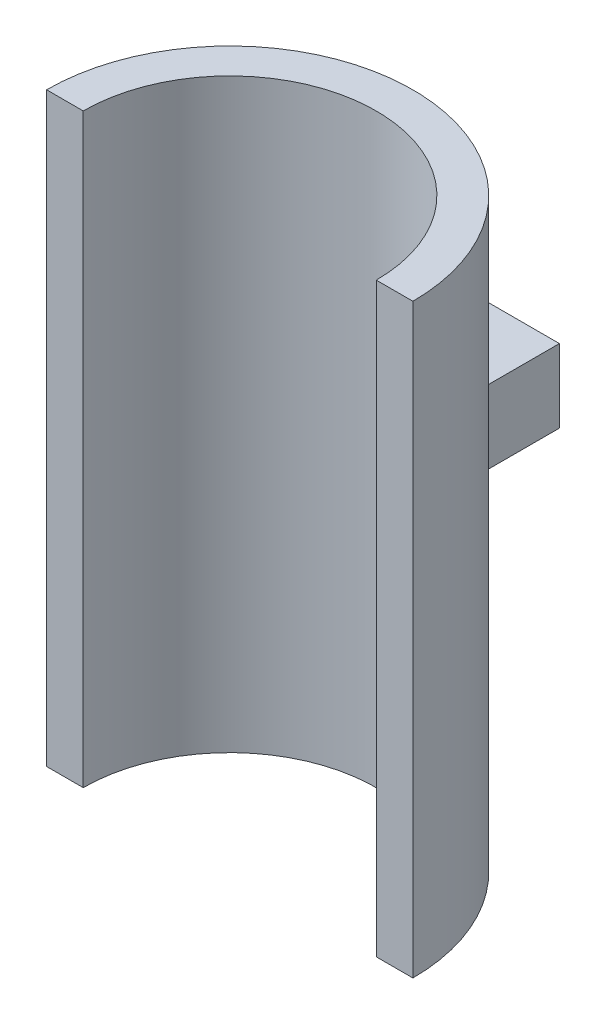
ISO-10303-21;
HEADER;
FILE_DESCRIPTION(('STEP AP214'),'2;1');
FILE_NAME('part.step','',(''),(''),'','','');
FILE_SCHEMA(('AUTOMOTIVE_DESIGN { 1 0 10303 214 1 1 1 1 }'));
ENDSEC;
DATA;
#1=APPLICATION_CONTEXT('core data for automotive mechanical design processes');
#2=APPLICATION_PROTOCOL_DEFINITION('international standard','automotive_design',2000,#1);
#3=PRODUCT_CONTEXT('',#1,'mechanical');
#4=PRODUCT('Part','Part','',(#3));
#5=PRODUCT_RELATED_PRODUCT_CATEGORY('part','',(#4));
#6=PRODUCT_DEFINITION_FORMATION('','',#4);
#7=PRODUCT_DEFINITION_CONTEXT('part definition',#1,'design');
#8=PRODUCT_DEFINITION('design','',#6,#7);
#9=PRODUCT_DEFINITION_SHAPE('','',#8);
#10=(LENGTH_UNIT() NAMED_UNIT(*) SI_UNIT(.MILLI.,.METRE.));
#11=(NAMED_UNIT(*) PLANE_ANGLE_UNIT() SI_UNIT($,.RADIAN.));
#12=(NAMED_UNIT(*) SI_UNIT($,.STERADIAN.) SOLID_ANGLE_UNIT());
#13=UNCERTAINTY_MEASURE_WITH_UNIT(LENGTH_MEASURE(1.E-05),#10,'distance_accuracy_value','');
#14=(GEOMETRIC_REPRESENTATION_CONTEXT(3) GLOBAL_UNCERTAINTY_ASSIGNED_CONTEXT((#13)) GLOBAL_UNIT_ASSIGNED_CONTEXT((#10,
#11,#12)) REPRESENTATION_CONTEXT('',''));
#15=CARTESIAN_POINT('',(0.,0.,0.));
#16=DIRECTION('',(0.,0.,1.));
#17=DIRECTION('',(1.,0.,0.));
#18=AXIS2_PLACEMENT_3D('',#15,#16,#17);
#19=CARTESIAN_POINT('',(0.,23.6596720559569,0.));
#20=DIRECTION('',(0.,-1.,0.));
#21=DIRECTION('',(0.,0.,-1.));
#22=AXIS2_PLACEMENT_3D('',#19,#20,#21);
#23=CYLINDRICAL_SURFACE('',#22,5.);
#24=CARTESIAN_POINT('',(0.,7.65967205595689,0.));
#25=DIRECTION('',(0.,1.,0.));
#26=DIRECTION('',(0.,0.,1.));
#27=AXIS2_PLACEMENT_3D('',#24,#25,#26);
#28=CIRCLE('',#27,5.);
#29=CARTESIAN_POINT('',(5.,7.65967205595689,0.));
#30=VERTEX_POINT('',#29);
#31=CARTESIAN_POINT('',(-5.,7.65967205595689,0.));
#32=VERTEX_POINT('',#31);
#33=EDGE_CURVE('E130',#30,#32,#28,.T.);
#34=ORIENTED_EDGE('',*,*,#33,.T.);
#35=DIRECTION('',(0.,-1.,0.));
#36=VECTOR('',#35,1.);
#37=CARTESIAN_POINT('',(-5.,23.6596720559569,0.));
#38=LINE('',#37,#36);
#39=CARTESIAN_POINT('',(-5.,23.6596720559569,0.));
#40=VERTEX_POINT('',#39);
#41=EDGE_CURVE('E11',#40,#32,#38,.T.);
#42=ORIENTED_EDGE('',*,*,#41,.F.);
#43=CARTESIAN_POINT('',(0.,23.6596720559569,0.));
#44=DIRECTION('',(0.,1.,0.));
#45=DIRECTION('',(0.,0.,1.));
#46=AXIS2_PLACEMENT_3D('',#43,#44,#45);
#47=CIRCLE('',#46,5.);
#48=CARTESIAN_POINT('',(5.,23.6596720559569,0.));
#49=VERTEX_POINT('',#48);
#50=EDGE_CURVE('E119',#49,#40,#47,.T.);
#51=ORIENTED_EDGE('',*,*,#50,.F.);
#52=DIRECTION('',(0.,-1.,0.));
#53=VECTOR('',#52,1.);
#54=CARTESIAN_POINT('',(5.,23.6596720559569,0.));
#55=LINE('',#54,#53);
#56=EDGE_CURVE('E129',#49,#30,#55,.T.);
#57=ORIENTED_EDGE('',*,*,#56,.T.);
#58=EDGE_LOOP('',(#34,#42,#51,#57));
#59=FACE_BOUND('',#58,.T.);
#60=DIRECTION('',(0.,-1.,0.));
#61=VECTOR('',#60,1.);
#62=CARTESIAN_POINT('',(1.,23.6596720559569,-4.89897948556636));
#63=LINE('',#62,#61);
#64=CARTESIAN_POINT('',(1.,14.6596720559569,-4.89897948556636));
#65=VERTEX_POINT('',#64);
#66=CARTESIAN_POINT('',(1.,16.6596720559569,-4.89897948556636));
#67=VERTEX_POINT('',#66);
#68=EDGE_CURVE('E45',#65,#67,#63,.F.);
#69=ORIENTED_EDGE('',*,*,#68,.T.);
#70=CARTESIAN_POINT('',(0.,16.6596720559569,0.));
#71=DIRECTION('',(0.,-1.,0.));
#72=DIRECTION('',(0.,0.,-1.));
#73=AXIS2_PLACEMENT_3D('',#70,#71,#72);
#74=CIRCLE('',#73,5.);
#75=CARTESIAN_POINT('',(-1.,16.6596720559569,-4.89897948556636));
#76=VERTEX_POINT('',#75);
#77=EDGE_CURVE('E49',#67,#76,#74,.F.);
#78=ORIENTED_EDGE('',*,*,#77,.T.);
#79=DIRECTION('',(0.,-1.,0.));
#80=VECTOR('',#79,1.);
#81=CARTESIAN_POINT('',(-1.,23.6596720559569,-4.89897948556636));
#82=LINE('',#81,#80);
#83=CARTESIAN_POINT('',(-1.,14.6596720559569,-4.89897948556636));
#84=VERTEX_POINT('',#83);
#85=EDGE_CURVE('E90',#76,#84,#82,.T.);
#86=ORIENTED_EDGE('',*,*,#85,.T.);
#87=CARTESIAN_POINT('',(0.,14.6596720559569,0.));
#88=DIRECTION('',(0.,1.,0.));
#89=DIRECTION('',(0.,0.,1.));
#90=AXIS2_PLACEMENT_3D('',#87,#88,#89);
#91=CIRCLE('',#90,5.);
#92=EDGE_CURVE('E92',#84,#65,#91,.F.);
#93=ORIENTED_EDGE('',*,*,#92,.T.);
#94=EDGE_LOOP('',(#69,#78,#86,#93));
#95=FACE_BOUND('',#94,.T.);
#96=ADVANCED_FACE('F31',(#59,#95),#23,.T.);
#97=CARTESIAN_POINT('',(-5.,23.6596720559569,0.));
#98=DIRECTION('',(0.,0.,-1.));
#99=DIRECTION('',(-1.,0.,0.));
#100=AXIS2_PLACEMENT_3D('',#97,#98,#99);
#101=PLANE('',#100);
#102=DIRECTION('',(1.,0.,0.));
#103=VECTOR('',#102,1.);
#104=CARTESIAN_POINT('',(-5.,7.65967205595689,0.));
#105=LINE('',#104,#103);
#106=CARTESIAN_POINT('',(-4.,7.65967205595689,0.));
#107=VERTEX_POINT('',#106);
#108=EDGE_CURVE('E133',#32,#107,#105,.T.);
#109=ORIENTED_EDGE('',*,*,#108,.T.);
#110=DIRECTION('',(0.,-1.,0.));
#111=VECTOR('',#110,1.);
#112=CARTESIAN_POINT('',(-4.,23.6596720559569,0.));
#113=LINE('',#112,#111);
#114=CARTESIAN_POINT('',(-4.,23.6596720559569,0.));
#115=VERTEX_POINT('',#114);
#116=EDGE_CURVE('E38',#115,#107,#113,.T.);
#117=ORIENTED_EDGE('',*,*,#116,.F.);
#118=DIRECTION('',(1.,0.,0.));
#119=VECTOR('',#118,1.);
#120=CARTESIAN_POINT('',(-5.,23.6596720559569,0.));
#121=LINE('',#120,#119);
#122=EDGE_CURVE('E122',#40,#115,#121,.T.);
#123=ORIENTED_EDGE('',*,*,#122,.F.);
#124=ORIENTED_EDGE('',*,*,#41,.T.);
#125=EDGE_LOOP('',(#109,#117,#123,#124));
#126=FACE_BOUND('',#125,.T.);
#127=ADVANCED_FACE('F164',(#126),#101,.F.);
#128=CARTESIAN_POINT('',(0.,23.6596720559569,0.));
#129=DIRECTION('',(0.,-1.,0.));
#130=DIRECTION('',(0.,0.,-1.));
#131=AXIS2_PLACEMENT_3D('',#128,#129,#130);
#132=CYLINDRICAL_SURFACE('',#131,4.);
#133=CARTESIAN_POINT('',(0.,7.65967205595689,0.));
#134=DIRECTION('',(0.,-1.,0.));
#135=DIRECTION('',(0.,0.,1.));
#136=AXIS2_PLACEMENT_3D('',#133,#134,#135);
#137=CIRCLE('',#136,4.);
#138=CARTESIAN_POINT('',(4.,7.65967205595689,0.));
#139=VERTEX_POINT('',#138);
#140=EDGE_CURVE('E136',#107,#139,#137,.T.);
#141=ORIENTED_EDGE('',*,*,#140,.T.);
#142=DIRECTION('',(0.,-1.,0.));
#143=VECTOR('',#142,1.);
#144=CARTESIAN_POINT('',(4.,23.6596720559569,0.));
#145=LINE('',#144,#143);
#146=CARTESIAN_POINT('',(4.,23.6596720559569,0.));
#147=VERTEX_POINT('',#146);
#148=EDGE_CURVE('E141',#147,#139,#145,.T.);
#149=ORIENTED_EDGE('',*,*,#148,.F.);
#150=CARTESIAN_POINT('',(0.,23.6596720559569,0.));
#151=DIRECTION('',(0.,-1.,0.));
#152=DIRECTION('',(0.,0.,1.));
#153=AXIS2_PLACEMENT_3D('',#150,#151,#152);
#154=CIRCLE('',#153,4.);
#155=EDGE_CURVE('E125',#115,#147,#154,.T.);
#156=ORIENTED_EDGE('',*,*,#155,.F.);
#157=ORIENTED_EDGE('',*,*,#116,.T.);
#158=EDGE_LOOP('',(#141,#149,#156,#157));
#159=FACE_BOUND('',#158,.T.);
#160=ADVANCED_FACE('F148',(#159),#132,.F.);
#161=CARTESIAN_POINT('',(4.,23.6596720559569,0.));
#162=DIRECTION('',(0.,0.,-1.));
#163=DIRECTION('',(-1.,0.,0.));
#164=AXIS2_PLACEMENT_3D('',#161,#162,#163);
#165=PLANE('',#164);
#166=DIRECTION('',(1.,0.,0.));
#167=VECTOR('',#166,1.);
#168=CARTESIAN_POINT('',(4.,7.65967205595689,0.));
#169=LINE('',#168,#167);
#170=EDGE_CURVE('E123',#139,#30,#169,.T.);
#171=ORIENTED_EDGE('',*,*,#170,.T.);
#172=ORIENTED_EDGE('',*,*,#56,.F.);
#173=DIRECTION('',(1.,0.,0.));
#174=VECTOR('',#173,1.);
#175=CARTESIAN_POINT('',(4.,23.6596720559569,0.));
#176=LINE('',#175,#174);
#177=EDGE_CURVE('E127',#147,#49,#176,.T.);
#178=ORIENTED_EDGE('',*,*,#177,.F.);
#179=ORIENTED_EDGE('',*,*,#148,.T.);
#180=EDGE_LOOP('',(#171,#172,#178,#179));
#181=FACE_BOUND('',#180,.T.);
#182=ADVANCED_FACE('F157',(#181),#165,.F.);
#183=CARTESIAN_POINT('',(0.,23.6596720559569,0.));
#184=DIRECTION('',(0.,1.,0.));
#185=DIRECTION('',(0.,0.,1.));
#186=AXIS2_PLACEMENT_3D('',#183,#184,#185);
#187=PLANE('',#186);
#188=ORIENTED_EDGE('',*,*,#50,.T.);
#189=ORIENTED_EDGE('',*,*,#122,.T.);
#190=ORIENTED_EDGE('',*,*,#155,.T.);
#191=ORIENTED_EDGE('',*,*,#177,.T.);
#192=EDGE_LOOP('',(#188,#189,#190,#191));
#193=FACE_BOUND('',#192,.T.);
#194=ADVANCED_FACE('F163',(#193),#187,.T.);
#195=CARTESIAN_POINT('',(0.,7.65967205595689,0.));
#196=DIRECTION('',(0.,1.,0.));
#197=DIRECTION('',(0.,0.,1.));
#198=AXIS2_PLACEMENT_3D('',#195,#196,#197);
#199=PLANE('',#198);
#200=ORIENTED_EDGE('',*,*,#33,.F.);
#201=ORIENTED_EDGE('',*,*,#170,.F.);
#202=ORIENTED_EDGE('',*,*,#140,.F.);
#203=ORIENTED_EDGE('',*,*,#108,.F.);
#204=EDGE_LOOP('',(#200,#201,#202,#203));
#205=FACE_BOUND('',#204,.T.);
#206=ADVANCED_FACE('F154',(#205),#199,.F.);
#207=CARTESIAN_POINT('',(1.,14.6596720559569,500000.));
#208=DIRECTION('',(-1.,0.,0.));
#209=DIRECTION('',(0.,0.,1.));
#210=AXIS2_PLACEMENT_3D('',#207,#208,#209);
#211=PLANE('',#210);
#212=ORIENTED_EDGE('',*,*,#68,.F.);
#213=DIRECTION('',(0.,0.,-1.));
#214=VECTOR('',#213,1.);
#215=CARTESIAN_POINT('',(1.,14.6596720559569,500000.));
#216=LINE('',#215,#214);
#217=CARTESIAN_POINT('',(1.,14.6596720559569,-8.));
#218=VERTEX_POINT('',#217);
#219=EDGE_CURVE('E103',#65,#218,#216,.T.);
#220=ORIENTED_EDGE('',*,*,#219,.T.);
#221=DIRECTION('',(0.,1.,0.));
#222=VECTOR('',#221,1.);
#223=CARTESIAN_POINT('',(1.,14.6596720559569,-8.));
#224=LINE('',#223,#222);
#225=CARTESIAN_POINT('',(1.,16.6596720559569,-8.));
#226=VERTEX_POINT('',#225);
#227=EDGE_CURVE('E134',#218,#226,#224,.T.);
#228=ORIENTED_EDGE('',*,*,#227,.T.);
#229=DIRECTION('',(0.,0.,-1.));
#230=VECTOR('',#229,1.);
#231=CARTESIAN_POINT('',(1.,16.6596720559569,500000.));
#232=LINE('',#231,#230);
#233=EDGE_CURVE('E113',#67,#226,#232,.T.);
#234=ORIENTED_EDGE('',*,*,#233,.F.);
#235=EDGE_LOOP('',(#212,#220,#228,#234));
#236=FACE_BOUND('',#235,.T.);
#237=ADVANCED_FACE('F176',(#236),#211,.F.);
#238=CARTESIAN_POINT('',(-1.,16.6596720559569,500000.));
#239=DIRECTION('',(0.,-1.,0.));
#240=DIRECTION('',(0.,0.,-1.));
#241=AXIS2_PLACEMENT_3D('',#238,#239,#240);
#242=PLANE('',#241);
#243=ORIENTED_EDGE('',*,*,#77,.F.);
#244=ORIENTED_EDGE('',*,*,#233,.T.);
#245=DIRECTION('',(-1.,0.,0.));
#246=VECTOR('',#245,1.);
#247=CARTESIAN_POINT('',(-1.,16.6596720559569,-8.));
#248=LINE('',#247,#246);
#249=CARTESIAN_POINT('',(-1.,16.6596720559569,-8.));
#250=VERTEX_POINT('',#249);
#251=EDGE_CURVE('E199',#226,#250,#248,.T.);
#252=ORIENTED_EDGE('',*,*,#251,.T.);
#253=DIRECTION('',(0.,0.,-1.));
#254=VECTOR('',#253,1.);
#255=CARTESIAN_POINT('',(-1.,16.6596720559569,500000.));
#256=LINE('',#255,#254);
#257=EDGE_CURVE('E109',#76,#250,#256,.T.);
#258=ORIENTED_EDGE('',*,*,#257,.F.);
#259=EDGE_LOOP('',(#243,#244,#252,#258));
#260=FACE_BOUND('',#259,.T.);
#261=ADVANCED_FACE('F184',(#260),#242,.F.);
#262=CARTESIAN_POINT('',(-1.,14.6596720559569,500000.));
#263=DIRECTION('',(1.,0.,0.));
#264=DIRECTION('',(0.,0.,-1.));
#265=AXIS2_PLACEMENT_3D('',#262,#263,#264);
#266=PLANE('',#265);
#267=ORIENTED_EDGE('',*,*,#85,.F.);
#268=ORIENTED_EDGE('',*,*,#257,.T.);
#269=DIRECTION('',(0.,-1.,0.));
#270=VECTOR('',#269,1.);
#271=CARTESIAN_POINT('',(-1.,14.6596720559569,-8.));
#272=LINE('',#271,#270);
#273=CARTESIAN_POINT('',(-1.,14.6596720559569,-8.));
#274=VERTEX_POINT('',#273);
#275=EDGE_CURVE('E107',#250,#274,#272,.T.);
#276=ORIENTED_EDGE('',*,*,#275,.T.);
#277=DIRECTION('',(0.,0.,-1.));
#278=VECTOR('',#277,1.);
#279=CARTESIAN_POINT('',(-1.,14.6596720559569,500000.));
#280=LINE('',#279,#278);
#281=EDGE_CURVE('E101',#84,#274,#280,.T.);
#282=ORIENTED_EDGE('',*,*,#281,.F.);
#283=EDGE_LOOP('',(#267,#268,#276,#282));
#284=FACE_BOUND('',#283,.T.);
#285=ADVANCED_FACE('F105',(#284),#266,.F.);
#286=CARTESIAN_POINT('',(-1.,14.6596720559569,500000.));
#287=DIRECTION('',(0.,1.,0.));
#288=DIRECTION('',(0.,0.,1.));
#289=AXIS2_PLACEMENT_3D('',#286,#287,#288);
#290=PLANE('',#289);
#291=ORIENTED_EDGE('',*,*,#92,.F.);
#292=ORIENTED_EDGE('',*,*,#281,.T.);
#293=DIRECTION('',(1.,0.,0.));
#294=VECTOR('',#293,1.);
#295=CARTESIAN_POINT('',(-1.,14.6596720559569,-8.));
#296=LINE('',#295,#294);
#297=EDGE_CURVE('E111',#274,#218,#296,.T.);
#298=ORIENTED_EDGE('',*,*,#297,.T.);
#299=ORIENTED_EDGE('',*,*,#219,.F.);
#300=EDGE_LOOP('',(#291,#292,#298,#299));
#301=FACE_BOUND('',#300,.T.);
#302=ADVANCED_FACE('F99',(#301),#290,.F.);
#303=CARTESIAN_POINT('',(1.,16.6596720559569,-8.));
#304=DIRECTION('',(0.,0.,-1.));
#305=DIRECTION('',(-1.,0.,0.));
#306=AXIS2_PLACEMENT_3D('',#303,#304,#305);
#307=PLANE('',#306);
#308=ORIENTED_EDGE('',*,*,#227,.F.);
#309=ORIENTED_EDGE('',*,*,#297,.F.);
#310=ORIENTED_EDGE('',*,*,#275,.F.);
#311=ORIENTED_EDGE('',*,*,#251,.F.);
#312=EDGE_LOOP('',(#308,#309,#310,#311));
#313=FACE_BOUND('',#312,.T.);
#314=ADVANCED_FACE('F177',(#313),#307,.T.);
#315=CLOSED_SHELL('',(#96,#127,#160,#182,#194,#206,#237,#261,#285,#302,#314));
#316=MANIFOLD_SOLID_BREP('B2',#315);
#317=ADVANCED_BREP_SHAPE_REPRESENTATION('',(#18,#316),#14);
#318=SHAPE_DEFINITION_REPRESENTATION(#9,#317);
ENDSEC;
END-ISO-10303-21;
